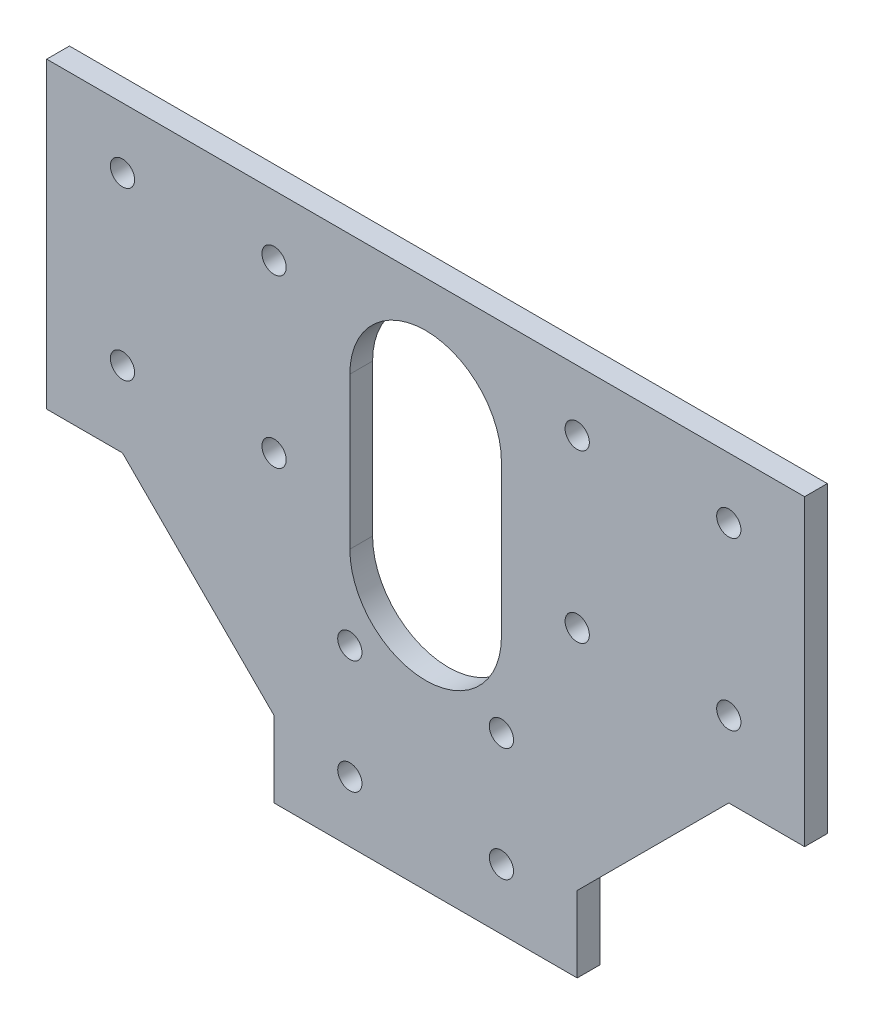
ISO-10303-21;
HEADER;
FILE_DESCRIPTION(('STEP AP214'),'2;1');
FILE_NAME('part.step','',(''),(''),'','','');
FILE_SCHEMA(('AUTOMOTIVE_DESIGN { 1 0 10303 214 1 1 1 1 }'));
ENDSEC;
DATA;
#1=APPLICATION_CONTEXT('core data for automotive mechanical design processes');
#2=APPLICATION_PROTOCOL_DEFINITION('international standard','automotive_design',2000,#1);
#3=PRODUCT_CONTEXT('',#1,'mechanical');
#4=PRODUCT('Part','Part','',(#3));
#5=PRODUCT_RELATED_PRODUCT_CATEGORY('part','',(#4));
#6=PRODUCT_DEFINITION_FORMATION('','',#4);
#7=PRODUCT_DEFINITION_CONTEXT('part definition',#1,'design');
#8=PRODUCT_DEFINITION('design','',#6,#7);
#9=PRODUCT_DEFINITION_SHAPE('','',#8);
#10=(LENGTH_UNIT() NAMED_UNIT(*) SI_UNIT(.MILLI.,.METRE.));
#11=(NAMED_UNIT(*) PLANE_ANGLE_UNIT() SI_UNIT($,.RADIAN.));
#12=(NAMED_UNIT(*) SI_UNIT($,.STERADIAN.) SOLID_ANGLE_UNIT());
#13=UNCERTAINTY_MEASURE_WITH_UNIT(LENGTH_MEASURE(1.E-05),#10,'distance_accuracy_value','');
#14=(GEOMETRIC_REPRESENTATION_CONTEXT(3) GLOBAL_UNCERTAINTY_ASSIGNED_CONTEXT((#13)) GLOBAL_UNIT_ASSIGNED_CONTEXT((#10,
#11,#12)) REPRESENTATION_CONTEXT('',''));
#15=CARTESIAN_POINT('',(0.,0.,0.));
#16=DIRECTION('',(0.,0.,1.));
#17=DIRECTION('',(1.,0.,0.));
#18=AXIS2_PLACEMENT_3D('',#15,#16,#17);
#19=CARTESIAN_POINT('',(-9.99999999999996,-10.,3.));
#20=DIRECTION('',(0.707106781186546,0.707106781186549,0.));
#21=DIRECTION('',(-0.707106781186549,0.707106781186546,0.));
#22=AXIS2_PLACEMENT_3D('',#19,#20,#21);
#23=PLANE('',#22);
#24=DIRECTION('',(0.707106781186549,-0.707106781186546,0.));
#25=VECTOR('',#24,1.);
#26=CARTESIAN_POINT('',(-9.99999999999996,-10.,0.));
#27=LINE('',#26,#25);
#28=CARTESIAN_POINT('',(-20.,0.,0.));
#29=VERTEX_POINT('',#28);
#30=CARTESIAN_POINT('',(0.,-19.9999999999999,0.));
#31=VERTEX_POINT('',#30);
#32=EDGE_CURVE('E242',#29,#31,#27,.T.);
#33=ORIENTED_EDGE('',*,*,#32,.T.);
#34=DIRECTION('',(0.,0.,-1.));
#35=VECTOR('',#34,1.);
#36=CARTESIAN_POINT('',(0.,-19.9999999999999,3.));
#37=LINE('',#36,#35);
#38=CARTESIAN_POINT('',(0.,-19.9999999999999,3.));
#39=VERTEX_POINT('',#38);
#40=EDGE_CURVE('E11',#39,#31,#37,.T.);
#41=ORIENTED_EDGE('',*,*,#40,.F.);
#42=DIRECTION('',(0.707106781186549,-0.707106781186546,0.));
#43=VECTOR('',#42,1.);
#44=CARTESIAN_POINT('',(-9.99999999999996,-10.,3.));
#45=LINE('',#44,#43);
#46=CARTESIAN_POINT('',(-20.,0.,3.));
#47=VERTEX_POINT('',#46);
#48=EDGE_CURVE('E245',#47,#39,#45,.T.);
#49=ORIENTED_EDGE('',*,*,#48,.F.);
#50=DIRECTION('',(0.,0.,-1.));
#51=VECTOR('',#50,1.);
#52=CARTESIAN_POINT('',(-20.,0.,3.));
#53=LINE('',#52,#51);
#54=EDGE_CURVE('E274',#47,#29,#53,.T.);
#55=ORIENTED_EDGE('',*,*,#54,.T.);
#56=EDGE_LOOP('',(#33,#41,#49,#55));
#57=FACE_BOUND('',#56,.T.);
#58=ADVANCED_FACE('F37',(#57),#23,.F.);
#59=CARTESIAN_POINT('',(0.,0.,3.));
#60=DIRECTION('',(-1.,0.,0.));
#61=DIRECTION('',(0.,-1.,0.));
#62=AXIS2_PLACEMENT_3D('',#59,#60,#61);
#63=PLANE('',#62);
#64=DIRECTION('',(0.,1.,0.));
#65=VECTOR('',#64,1.);
#66=CARTESIAN_POINT('',(0.,0.,0.));
#67=LINE('',#66,#65);
#68=CARTESIAN_POINT('',(0.,-30.,0.));
#69=VERTEX_POINT('',#68);
#70=EDGE_CURVE('E277',#69,#31,#67,.T.);
#71=ORIENTED_EDGE('',*,*,#70,.F.);
#72=DIRECTION('',(0.,0.,-1.));
#73=VECTOR('',#72,1.);
#74=CARTESIAN_POINT('',(0.,-30.,3.));
#75=LINE('',#74,#73);
#76=CARTESIAN_POINT('',(0.,-30.,3.));
#77=VERTEX_POINT('',#76);
#78=EDGE_CURVE('E44',#77,#69,#75,.T.);
#79=ORIENTED_EDGE('',*,*,#78,.F.);
#80=DIRECTION('',(0.,1.,0.));
#81=VECTOR('',#80,1.);
#82=CARTESIAN_POINT('',(0.,0.,3.));
#83=LINE('',#82,#81);
#84=EDGE_CURVE('E247',#77,#39,#83,.T.);
#85=ORIENTED_EDGE('',*,*,#84,.T.);
#86=ORIENTED_EDGE('',*,*,#40,.T.);
#87=EDGE_LOOP('',(#71,#79,#85,#86));
#88=FACE_BOUND('',#87,.T.);
#89=ADVANCED_FACE('F324',(#88),#63,.T.);
#90=CARTESIAN_POINT('',(0.,-30.,3.));
#91=DIRECTION('',(0.,-1.,0.));
#92=DIRECTION('',(1.,0.,0.));
#93=AXIS2_PLACEMENT_3D('',#90,#91,#92);
#94=PLANE('',#93);
#95=DIRECTION('',(-1.,0.,0.));
#96=VECTOR('',#95,1.);
#97=CARTESIAN_POINT('',(0.,-30.,0.));
#98=LINE('',#97,#96);
#99=CARTESIAN_POINT('',(40.,-30.,0.));
#100=VERTEX_POINT('',#99);
#101=EDGE_CURVE('E280',#100,#69,#98,.T.);
#102=ORIENTED_EDGE('',*,*,#101,.F.);
#103=DIRECTION('',(0.,0.,-1.));
#104=VECTOR('',#103,1.);
#105=CARTESIAN_POINT('',(40.,-30.,3.));
#106=LINE('',#105,#104);
#107=CARTESIAN_POINT('',(40.,-30.,3.));
#108=VERTEX_POINT('',#107);
#109=EDGE_CURVE('E316',#108,#100,#106,.T.);
#110=ORIENTED_EDGE('',*,*,#109,.F.);
#111=DIRECTION('',(-1.,0.,0.));
#112=VECTOR('',#111,1.);
#113=CARTESIAN_POINT('',(0.,-30.,3.));
#114=LINE('',#113,#112);
#115=EDGE_CURVE('E251',#108,#77,#114,.T.);
#116=ORIENTED_EDGE('',*,*,#115,.T.);
#117=ORIENTED_EDGE('',*,*,#78,.T.);
#118=EDGE_LOOP('',(#102,#110,#116,#117));
#119=FACE_BOUND('',#118,.T.);
#120=ADVANCED_FACE('F320',(#119),#94,.T.);
#121=CARTESIAN_POINT('',(40.,0.,3.));
#122=DIRECTION('',(1.,0.,0.));
#123=DIRECTION('',(0.,1.,0.));
#124=AXIS2_PLACEMENT_3D('',#121,#122,#123);
#125=PLANE('',#124);
#126=DIRECTION('',(0.,-1.,0.));
#127=VECTOR('',#126,1.);
#128=CARTESIAN_POINT('',(40.,0.,0.));
#129=LINE('',#128,#127);
#130=CARTESIAN_POINT('',(40.,-19.9999999999999,0.));
#131=VERTEX_POINT('',#130);
#132=EDGE_CURVE('E283',#131,#100,#129,.T.);
#133=ORIENTED_EDGE('',*,*,#132,.F.);
#134=DIRECTION('',(0.,0.,-1.));
#135=VECTOR('',#134,1.);
#136=CARTESIAN_POINT('',(40.,-19.9999999999999,3.));
#137=LINE('',#136,#135);
#138=CARTESIAN_POINT('',(40.,-19.9999999999999,3.));
#139=VERTEX_POINT('',#138);
#140=EDGE_CURVE('E314',#139,#131,#137,.T.);
#141=ORIENTED_EDGE('',*,*,#140,.F.);
#142=DIRECTION('',(0.,-1.,0.));
#143=VECTOR('',#142,1.);
#144=CARTESIAN_POINT('',(40.,0.,3.));
#145=LINE('',#144,#143);
#146=EDGE_CURVE('E254',#139,#108,#145,.T.);
#147=ORIENTED_EDGE('',*,*,#146,.T.);
#148=ORIENTED_EDGE('',*,*,#109,.T.);
#149=EDGE_LOOP('',(#133,#141,#147,#148));
#150=FACE_BOUND('',#149,.T.);
#151=ADVANCED_FACE('F331',(#150),#125,.T.);
#152=CARTESIAN_POINT('',(29.9999999999999,-30.,3.));
#153=DIRECTION('',(-0.707106781186546,0.707106781186548,0.));
#154=DIRECTION('',(-0.707106781186549,-0.707106781186546,0.));
#155=AXIS2_PLACEMENT_3D('',#152,#153,#154);
#156=PLANE('',#155);
#157=DIRECTION('',(0.707106781186549,0.707106781186546,0.));
#158=VECTOR('',#157,1.);
#159=CARTESIAN_POINT('',(29.9999999999999,-30.,0.));
#160=LINE('',#159,#158);
#161=CARTESIAN_POINT('',(60.,0.,0.));
#162=VERTEX_POINT('',#161);
#163=EDGE_CURVE('E286',#131,#162,#160,.T.);
#164=ORIENTED_EDGE('',*,*,#163,.T.);
#165=DIRECTION('',(0.,0.,-1.));
#166=VECTOR('',#165,1.);
#167=CARTESIAN_POINT('',(60.,0.,3.));
#168=LINE('',#167,#166);
#169=CARTESIAN_POINT('',(60.,0.,3.));
#170=VERTEX_POINT('',#169);
#171=EDGE_CURVE('E312',#170,#162,#168,.T.);
#172=ORIENTED_EDGE('',*,*,#171,.F.);
#173=DIRECTION('',(0.707106781186549,0.707106781186546,0.));
#174=VECTOR('',#173,1.);
#175=CARTESIAN_POINT('',(29.9999999999999,-30.,3.));
#176=LINE('',#175,#174);
#177=EDGE_CURVE('E257',#139,#170,#176,.T.);
#178=ORIENTED_EDGE('',*,*,#177,.F.);
#179=ORIENTED_EDGE('',*,*,#140,.T.);
#180=EDGE_LOOP('',(#164,#172,#178,#179));
#181=FACE_BOUND('',#180,.T.);
#182=ADVANCED_FACE('F360',(#181),#156,.F.);
#183=CARTESIAN_POINT('',(0.,0.,3.));
#184=DIRECTION('',(0.,-1.,0.));
#185=DIRECTION('',(1.,0.,0.));
#186=AXIS2_PLACEMENT_3D('',#183,#184,#185);
#187=PLANE('',#186);
#188=DIRECTION('',(-1.,0.,0.));
#189=VECTOR('',#188,1.);
#190=CARTESIAN_POINT('',(0.,0.,0.));
#191=LINE('',#190,#189);
#192=CARTESIAN_POINT('',(70.,0.,0.));
#193=VERTEX_POINT('',#192);
#194=EDGE_CURVE('E289',#193,#162,#191,.T.);
#195=ORIENTED_EDGE('',*,*,#194,.F.);
#196=DIRECTION('',(0.,0.,-1.));
#197=VECTOR('',#196,1.);
#198=CARTESIAN_POINT('',(70.,0.,3.));
#199=LINE('',#198,#197);
#200=CARTESIAN_POINT('',(70.,0.,3.));
#201=VERTEX_POINT('',#200);
#202=EDGE_CURVE('E310',#201,#193,#199,.T.);
#203=ORIENTED_EDGE('',*,*,#202,.F.);
#204=DIRECTION('',(-1.,0.,0.));
#205=VECTOR('',#204,1.);
#206=CARTESIAN_POINT('',(0.,0.,3.));
#207=LINE('',#206,#205);
#208=EDGE_CURVE('E259',#201,#170,#207,.T.);
#209=ORIENTED_EDGE('',*,*,#208,.T.);
#210=ORIENTED_EDGE('',*,*,#171,.T.);
#211=EDGE_LOOP('',(#195,#203,#209,#210));
#212=FACE_BOUND('',#211,.T.);
#213=ADVANCED_FACE('F357',(#212),#187,.T.);
#214=CARTESIAN_POINT('',(70.,0.,3.));
#215=DIRECTION('',(1.,0.,0.));
#216=DIRECTION('',(0.,0.,-1.));
#217=AXIS2_PLACEMENT_3D('',#214,#215,#216);
#218=PLANE('',#217);
#219=DIRECTION('',(0.,-1.,0.));
#220=VECTOR('',#219,1.);
#221=CARTESIAN_POINT('',(70.,0.,0.));
#222=LINE('',#221,#220);
#223=CARTESIAN_POINT('',(70.,40.,0.));
#224=VERTEX_POINT('',#223);
#225=EDGE_CURVE('E292',#224,#193,#222,.T.);
#226=ORIENTED_EDGE('',*,*,#225,.F.);
#227=DIRECTION('',(0.,0.,-1.));
#228=VECTOR('',#227,1.);
#229=CARTESIAN_POINT('',(70.,40.,3.));
#230=LINE('',#229,#228);
#231=CARTESIAN_POINT('',(70.,40.,3.));
#232=VERTEX_POINT('',#231);
#233=EDGE_CURVE('E308',#232,#224,#230,.T.);
#234=ORIENTED_EDGE('',*,*,#233,.F.);
#235=DIRECTION('',(0.,-1.,0.));
#236=VECTOR('',#235,1.);
#237=CARTESIAN_POINT('',(70.,0.,3.));
#238=LINE('',#237,#236);
#239=EDGE_CURVE('E262',#232,#201,#238,.T.);
#240=ORIENTED_EDGE('',*,*,#239,.T.);
#241=ORIENTED_EDGE('',*,*,#202,.T.);
#242=EDGE_LOOP('',(#226,#234,#240,#241));
#243=FACE_BOUND('',#242,.T.);
#244=ADVANCED_FACE('F353',(#243),#218,.T.);
#245=CARTESIAN_POINT('',(0.,40.,3.));
#246=DIRECTION('',(0.,1.,0.));
#247=DIRECTION('',(0.,0.,1.));
#248=AXIS2_PLACEMENT_3D('',#245,#246,#247);
#249=PLANE('',#248);
#250=DIRECTION('',(1.,0.,0.));
#251=VECTOR('',#250,1.);
#252=CARTESIAN_POINT('',(0.,40.,0.));
#253=LINE('',#252,#251);
#254=CARTESIAN_POINT('',(-30.,40.,0.));
#255=VERTEX_POINT('',#254);
#256=EDGE_CURVE('E295',#255,#224,#253,.T.);
#257=ORIENTED_EDGE('',*,*,#256,.F.);
#258=DIRECTION('',(0.,0.,-1.));
#259=VECTOR('',#258,1.);
#260=CARTESIAN_POINT('',(-30.,40.,3.));
#261=LINE('',#260,#259);
#262=CARTESIAN_POINT('',(-30.,40.,3.));
#263=VERTEX_POINT('',#262);
#264=EDGE_CURVE('E306',#263,#255,#261,.T.);
#265=ORIENTED_EDGE('',*,*,#264,.F.);
#266=DIRECTION('',(1.,0.,0.));
#267=VECTOR('',#266,1.);
#268=CARTESIAN_POINT('',(0.,40.,3.));
#269=LINE('',#268,#267);
#270=EDGE_CURVE('E265',#263,#232,#269,.T.);
#271=ORIENTED_EDGE('',*,*,#270,.T.);
#272=ORIENTED_EDGE('',*,*,#233,.T.);
#273=EDGE_LOOP('',(#257,#265,#271,#272));
#274=FACE_BOUND('',#273,.T.);
#275=ADVANCED_FACE('F349',(#274),#249,.T.);
#276=CARTESIAN_POINT('',(-30.,0.,3.));
#277=DIRECTION('',(-1.,0.,0.));
#278=DIRECTION('',(0.,0.,1.));
#279=AXIS2_PLACEMENT_3D('',#276,#277,#278);
#280=PLANE('',#279);
#281=DIRECTION('',(0.,1.,0.));
#282=VECTOR('',#281,1.);
#283=CARTESIAN_POINT('',(-30.,0.,0.));
#284=LINE('',#283,#282);
#285=CARTESIAN_POINT('',(-30.,0.,0.));
#286=VERTEX_POINT('',#285);
#287=EDGE_CURVE('E298',#286,#255,#284,.T.);
#288=ORIENTED_EDGE('',*,*,#287,.F.);
#289=DIRECTION('',(0.,0.,-1.));
#290=VECTOR('',#289,1.);
#291=CARTESIAN_POINT('',(-30.,0.,3.));
#292=LINE('',#291,#290);
#293=CARTESIAN_POINT('',(-30.,0.,3.));
#294=VERTEX_POINT('',#293);
#295=EDGE_CURVE('E304',#294,#286,#292,.T.);
#296=ORIENTED_EDGE('',*,*,#295,.F.);
#297=DIRECTION('',(0.,1.,0.));
#298=VECTOR('',#297,1.);
#299=CARTESIAN_POINT('',(-30.,0.,3.));
#300=LINE('',#299,#298);
#301=EDGE_CURVE('E268',#294,#263,#300,.T.);
#302=ORIENTED_EDGE('',*,*,#301,.T.);
#303=ORIENTED_EDGE('',*,*,#264,.T.);
#304=EDGE_LOOP('',(#288,#296,#302,#303));
#305=FACE_BOUND('',#304,.T.);
#306=ADVANCED_FACE('F345',(#305),#280,.T.);
#307=CARTESIAN_POINT('',(0.,0.,3.));
#308=DIRECTION('',(0.,-1.,0.));
#309=DIRECTION('',(1.,0.,0.));
#310=AXIS2_PLACEMENT_3D('',#307,#308,#309);
#311=PLANE('',#310);
#312=DIRECTION('',(-1.,0.,0.));
#313=VECTOR('',#312,1.);
#314=CARTESIAN_POINT('',(0.,0.,0.));
#315=LINE('',#314,#313);
#316=EDGE_CURVE('E248',#29,#286,#315,.T.);
#317=ORIENTED_EDGE('',*,*,#316,.F.);
#318=ORIENTED_EDGE('',*,*,#54,.F.);
#319=DIRECTION('',(-1.,0.,0.));
#320=VECTOR('',#319,1.);
#321=CARTESIAN_POINT('',(0.,0.,3.));
#322=LINE('',#321,#320);
#323=EDGE_CURVE('E271',#47,#294,#322,.T.);
#324=ORIENTED_EDGE('',*,*,#323,.T.);
#325=ORIENTED_EDGE('',*,*,#295,.T.);
#326=EDGE_LOOP('',(#317,#318,#324,#325));
#327=FACE_BOUND('',#326,.T.);
#328=ADVANCED_FACE('F342',(#327),#311,.T.);
#329=CARTESIAN_POINT('',(0.,0.,3.));
#330=DIRECTION('',(0.,0.,1.));
#331=DIRECTION('',(1.,0.,0.));
#332=AXIS2_PLACEMENT_3D('',#329,#330,#331);
#333=PLANE('',#332);
#334=CARTESIAN_POINT('',(20.,24.,3.));
#335=DIRECTION('',(0.,0.,1.));
#336=DIRECTION('',(1.,0.,0.));
#337=AXIS2_PLACEMENT_3D('',#334,#335,#336);
#338=CIRCLE('',#337,9.99999999999999);
#339=CARTESIAN_POINT('',(30.,24.,3.));
#340=VERTEX_POINT('',#339);
#341=CARTESIAN_POINT('',(10.,24.,3.));
#342=VERTEX_POINT('',#341);
#343=EDGE_CURVE('E51',#340,#342,#338,.T.);
#344=ORIENTED_EDGE('',*,*,#343,.F.);
#345=DIRECTION('',(0.,1.,0.));
#346=VECTOR('',#345,1.);
#347=CARTESIAN_POINT('',(30.,24.,3.));
#348=LINE('',#347,#346);
#349=CARTESIAN_POINT('',(30.,4.00000000000001,3.));
#350=VERTEX_POINT('',#349);
#351=EDGE_CURVE('E154',#350,#340,#348,.T.);
#352=ORIENTED_EDGE('',*,*,#351,.F.);
#353=CARTESIAN_POINT('',(20.,4.,3.));
#354=DIRECTION('',(0.,0.,1.));
#355=DIRECTION('',(1.,0.,0.));
#356=AXIS2_PLACEMENT_3D('',#353,#354,#355);
#357=CIRCLE('',#356,9.99999999999999);
#358=CARTESIAN_POINT('',(10.,4.,3.));
#359=VERTEX_POINT('',#358);
#360=EDGE_CURVE('E157',#359,#350,#357,.T.);
#361=ORIENTED_EDGE('',*,*,#360,.F.);
#362=DIRECTION('',(0.,-1.,0.));
#363=VECTOR('',#362,1.);
#364=CARTESIAN_POINT('',(10.,24.,3.));
#365=LINE('',#364,#363);
#366=EDGE_CURVE('E163',#342,#359,#365,.T.);
#367=ORIENTED_EDGE('',*,*,#366,.F.);
#368=EDGE_LOOP('',(#344,#352,#361,#367));
#369=FACE_BOUND('',#368,.T.);
#370=CARTESIAN_POINT('',(60.,10.,3.));
#371=DIRECTION('',(0.,0.,1.));
#372=DIRECTION('',(1.,0.,0.));
#373=AXIS2_PLACEMENT_3D('',#370,#371,#372);
#374=CIRCLE('',#373,1.6);
#375=CARTESIAN_POINT('',(61.6,10.,3.));
#376=VERTEX_POINT('',#375);
#377=EDGE_CURVE('E176',#376,#376,#374,.T.);
#378=ORIENTED_EDGE('',*,*,#377,.F.);
#379=EDGE_LOOP('',(#378));
#380=FACE_BOUND('',#379,.T.);
#381=CARTESIAN_POINT('',(40.,10.,3.));
#382=DIRECTION('',(0.,0.,1.));
#383=DIRECTION('',(1.,0.,0.));
#384=AXIS2_PLACEMENT_3D('',#381,#382,#383);
#385=CIRCLE('',#384,1.6);
#386=CARTESIAN_POINT('',(41.6,10.,3.));
#387=VERTEX_POINT('',#386);
#388=EDGE_CURVE('E207',#387,#387,#385,.T.);
#389=ORIENTED_EDGE('',*,*,#388,.F.);
#390=EDGE_LOOP('',(#389));
#391=FACE_BOUND('',#390,.T.);
#392=CARTESIAN_POINT('',(0.,10.,3.));
#393=DIRECTION('',(0.,0.,1.));
#394=DIRECTION('',(1.,0.,0.));
#395=AXIS2_PLACEMENT_3D('',#392,#393,#394);
#396=CIRCLE('',#395,1.6);
#397=CARTESIAN_POINT('',(1.60000000000001,10.,3.));
#398=VERTEX_POINT('',#397);
#399=EDGE_CURVE('E201',#398,#398,#396,.T.);
#400=ORIENTED_EDGE('',*,*,#399,.F.);
#401=EDGE_LOOP('',(#400));
#402=FACE_BOUND('',#401,.T.);
#403=CARTESIAN_POINT('',(-20.,32.,3.));
#404=DIRECTION('',(0.,0.,1.));
#405=DIRECTION('',(1.,0.,0.));
#406=AXIS2_PLACEMENT_3D('',#403,#404,#405);
#407=CIRCLE('',#406,1.6);
#408=CARTESIAN_POINT('',(-18.4,32.,3.));
#409=VERTEX_POINT('',#408);
#410=EDGE_CURVE('E195',#409,#409,#407,.T.);
#411=ORIENTED_EDGE('',*,*,#410,.F.);
#412=EDGE_LOOP('',(#411));
#413=FACE_BOUND('',#412,.T.);
#414=CARTESIAN_POINT('',(30.,-7.,3.));
#415=DIRECTION('',(0.,0.,1.));
#416=DIRECTION('',(1.,0.,0.));
#417=AXIS2_PLACEMENT_3D('',#414,#415,#416);
#418=CIRCLE('',#417,1.60000000000001);
#419=CARTESIAN_POINT('',(31.6,-7.,3.));
#420=VERTEX_POINT('',#419);
#421=EDGE_CURVE('E231',#420,#420,#418,.T.);
#422=ORIENTED_EDGE('',*,*,#421,.F.);
#423=EDGE_LOOP('',(#422));
#424=FACE_BOUND('',#423,.T.);
#425=CARTESIAN_POINT('',(10.,-22.,3.));
#426=DIRECTION('',(0.,0.,1.));
#427=DIRECTION('',(1.,0.,0.));
#428=AXIS2_PLACEMENT_3D('',#425,#426,#427);
#429=CIRCLE('',#428,1.6);
#430=CARTESIAN_POINT('',(11.6,-22.,3.));
#431=VERTEX_POINT('',#430);
#432=EDGE_CURVE('E218',#431,#431,#429,.T.);
#433=ORIENTED_EDGE('',*,*,#432,.F.);
#434=EDGE_LOOP('',(#433));
#435=FACE_BOUND('',#434,.T.);
#436=CARTESIAN_POINT('',(30.,-22.,3.));
#437=DIRECTION('',(0.,0.,1.));
#438=DIRECTION('',(1.,0.,0.));
#439=AXIS2_PLACEMENT_3D('',#436,#437,#438);
#440=CIRCLE('',#439,1.6);
#441=CARTESIAN_POINT('',(31.6,-22.,3.));
#442=VERTEX_POINT('',#441);
#443=EDGE_CURVE('E219',#442,#442,#440,.T.);
#444=ORIENTED_EDGE('',*,*,#443,.F.);
#445=EDGE_LOOP('',(#444));
#446=FACE_BOUND('',#445,.T.);
#447=CARTESIAN_POINT('',(-20.,10.,3.));
#448=DIRECTION('',(0.,0.,1.));
#449=DIRECTION('',(1.,0.,0.));
#450=AXIS2_PLACEMENT_3D('',#447,#448,#449);
#451=CIRCLE('',#450,1.6);
#452=CARTESIAN_POINT('',(-18.4,10.,3.));
#453=VERTEX_POINT('',#452);
#454=EDGE_CURVE('E194',#453,#453,#451,.T.);
#455=ORIENTED_EDGE('',*,*,#454,.F.);
#456=EDGE_LOOP('',(#455));
#457=FACE_BOUND('',#456,.T.);
#458=CARTESIAN_POINT('',(60.,32.,3.));
#459=DIRECTION('',(0.,0.,1.));
#460=DIRECTION('',(1.,0.,0.));
#461=AXIS2_PLACEMENT_3D('',#458,#459,#460);
#462=CIRCLE('',#461,1.6);
#463=CARTESIAN_POINT('',(61.6,32.,3.));
#464=VERTEX_POINT('',#463);
#465=EDGE_CURVE('E177',#464,#464,#462,.T.);
#466=ORIENTED_EDGE('',*,*,#465,.F.);
#467=EDGE_LOOP('',(#466));
#468=FACE_BOUND('',#467,.T.);
#469=CARTESIAN_POINT('',(40.,32.,3.));
#470=DIRECTION('',(0.,0.,1.));
#471=DIRECTION('',(1.,0.,0.));
#472=AXIS2_PLACEMENT_3D('',#469,#470,#471);
#473=CIRCLE('',#472,1.6);
#474=CARTESIAN_POINT('',(41.6,32.,3.));
#475=VERTEX_POINT('',#474);
#476=EDGE_CURVE('E183',#475,#475,#473,.T.);
#477=ORIENTED_EDGE('',*,*,#476,.F.);
#478=EDGE_LOOP('',(#477));
#479=FACE_BOUND('',#478,.T.);
#480=CARTESIAN_POINT('',(0.,32.,3.));
#481=DIRECTION('',(0.,0.,1.));
#482=DIRECTION('',(1.,0.,0.));
#483=AXIS2_PLACEMENT_3D('',#480,#481,#482);
#484=CIRCLE('',#483,1.6);
#485=CARTESIAN_POINT('',(1.6,32.,3.));
#486=VERTEX_POINT('',#485);
#487=EDGE_CURVE('E169',#486,#486,#484,.T.);
#488=ORIENTED_EDGE('',*,*,#487,.F.);
#489=EDGE_LOOP('',(#488));
#490=FACE_BOUND('',#489,.T.);
#491=CARTESIAN_POINT('',(10.,-7.,3.));
#492=DIRECTION('',(0.,0.,1.));
#493=DIRECTION('',(1.,0.,0.));
#494=AXIS2_PLACEMENT_3D('',#491,#492,#493);
#495=CIRCLE('',#494,1.6);
#496=CARTESIAN_POINT('',(11.6,-7.,3.));
#497=VERTEX_POINT('',#496);
#498=EDGE_CURVE('E230',#497,#497,#495,.T.);
#499=ORIENTED_EDGE('',*,*,#498,.F.);
#500=EDGE_LOOP('',(#499));
#501=FACE_BOUND('',#500,.T.);
#502=ORIENTED_EDGE('',*,*,#48,.T.);
#503=ORIENTED_EDGE('',*,*,#84,.F.);
#504=ORIENTED_EDGE('',*,*,#115,.F.);
#505=ORIENTED_EDGE('',*,*,#146,.F.);
#506=ORIENTED_EDGE('',*,*,#177,.T.);
#507=ORIENTED_EDGE('',*,*,#208,.F.);
#508=ORIENTED_EDGE('',*,*,#239,.F.);
#509=ORIENTED_EDGE('',*,*,#270,.F.);
#510=ORIENTED_EDGE('',*,*,#301,.F.);
#511=ORIENTED_EDGE('',*,*,#323,.F.);
#512=EDGE_LOOP('',(#502,#503,#504,#505,#506,#507,#508,#509,#510,#511));
#513=FACE_BOUND('',#512,.T.);
#514=ADVANCED_FACE('F335',(#369,#380,#391,#402,#413,#424,#435,#446,#457,#468,#479,#490,#501,
#513),#333,.T.);
#515=CARTESIAN_POINT('',(0.,0.,0.));
#516=DIRECTION('',(0.,0.,1.));
#517=DIRECTION('',(1.,0.,0.));
#518=AXIS2_PLACEMENT_3D('',#515,#516,#517);
#519=PLANE('',#518);
#520=DIRECTION('',(0.,1.,0.));
#521=VECTOR('',#520,1.);
#522=CARTESIAN_POINT('',(30.,24.,0.));
#523=LINE('',#522,#521);
#524=CARTESIAN_POINT('',(30.,4.00000000000001,0.));
#525=VERTEX_POINT('',#524);
#526=CARTESIAN_POINT('',(30.,24.,0.));
#527=VERTEX_POINT('',#526);
#528=EDGE_CURVE('E144',#525,#527,#523,.T.);
#529=ORIENTED_EDGE('',*,*,#528,.T.);
#530=CARTESIAN_POINT('',(20.,24.,0.));
#531=DIRECTION('',(0.,0.,1.));
#532=DIRECTION('',(1.,0.,0.));
#533=AXIS2_PLACEMENT_3D('',#530,#531,#532);
#534=CIRCLE('',#533,9.99999999999999);
#535=CARTESIAN_POINT('',(10.,24.,0.));
#536=VERTEX_POINT('',#535);
#537=EDGE_CURVE('E138',#527,#536,#534,.T.);
#538=ORIENTED_EDGE('',*,*,#537,.T.);
#539=DIRECTION('',(0.,-1.,0.));
#540=VECTOR('',#539,1.);
#541=CARTESIAN_POINT('',(10.,24.,0.));
#542=LINE('',#541,#540);
#543=CARTESIAN_POINT('',(10.,4.,0.));
#544=VERTEX_POINT('',#543);
#545=EDGE_CURVE('E147',#536,#544,#542,.T.);
#546=ORIENTED_EDGE('',*,*,#545,.T.);
#547=CARTESIAN_POINT('',(20.,4.,0.));
#548=DIRECTION('',(0.,0.,1.));
#549=DIRECTION('',(1.,0.,0.));
#550=AXIS2_PLACEMENT_3D('',#547,#548,#549);
#551=CIRCLE('',#550,9.99999999999999);
#552=EDGE_CURVE('E59',#544,#525,#551,.T.);
#553=ORIENTED_EDGE('',*,*,#552,.T.);
#554=EDGE_LOOP('',(#529,#538,#546,#553));
#555=FACE_BOUND('',#554,.T.);
#556=CARTESIAN_POINT('',(60.,10.,0.));
#557=DIRECTION('',(0.,0.,1.));
#558=DIRECTION('',(1.,0.,0.));
#559=AXIS2_PLACEMENT_3D('',#556,#557,#558);
#560=CIRCLE('',#559,1.6);
#561=CARTESIAN_POINT('',(61.6,10.,0.));
#562=VERTEX_POINT('',#561);
#563=EDGE_CURVE('E210',#562,#562,#560,.T.);
#564=ORIENTED_EDGE('',*,*,#563,.T.);
#565=EDGE_LOOP('',(#564));
#566=FACE_BOUND('',#565,.T.);
#567=CARTESIAN_POINT('',(40.,10.,0.));
#568=DIRECTION('',(0.,0.,1.));
#569=DIRECTION('',(1.,0.,0.));
#570=AXIS2_PLACEMENT_3D('',#567,#568,#569);
#571=CIRCLE('',#570,1.6);
#572=CARTESIAN_POINT('',(41.6,10.,0.));
#573=VERTEX_POINT('',#572);
#574=EDGE_CURVE('E204',#573,#573,#571,.T.);
#575=ORIENTED_EDGE('',*,*,#574,.T.);
#576=EDGE_LOOP('',(#575));
#577=FACE_BOUND('',#576,.T.);
#578=CARTESIAN_POINT('',(0.,10.,0.));
#579=DIRECTION('',(0.,0.,1.));
#580=DIRECTION('',(1.,0.,0.));
#581=AXIS2_PLACEMENT_3D('',#578,#579,#580);
#582=CIRCLE('',#581,1.6);
#583=CARTESIAN_POINT('',(1.60000000000001,10.,0.));
#584=VERTEX_POINT('',#583);
#585=EDGE_CURVE('E198',#584,#584,#582,.T.);
#586=ORIENTED_EDGE('',*,*,#585,.T.);
#587=EDGE_LOOP('',(#586));
#588=FACE_BOUND('',#587,.T.);
#589=CARTESIAN_POINT('',(-20.,32.,0.));
#590=DIRECTION('',(0.,0.,1.));
#591=DIRECTION('',(1.,0.,0.));
#592=AXIS2_PLACEMENT_3D('',#589,#590,#591);
#593=CIRCLE('',#592,1.6);
#594=CARTESIAN_POINT('',(-18.4,32.,0.));
#595=VERTEX_POINT('',#594);
#596=EDGE_CURVE('E191',#595,#595,#593,.T.);
#597=ORIENTED_EDGE('',*,*,#596,.T.);
#598=EDGE_LOOP('',(#597));
#599=FACE_BOUND('',#598,.T.);
#600=CARTESIAN_POINT('',(30.,-7.,0.));
#601=DIRECTION('',(0.,0.,1.));
#602=DIRECTION('',(1.,0.,0.));
#603=AXIS2_PLACEMENT_3D('',#600,#601,#602);
#604=CIRCLE('',#603,1.60000000000001);
#605=CARTESIAN_POINT('',(31.6,-7.,0.));
#606=VERTEX_POINT('',#605);
#607=EDGE_CURVE('E227',#606,#606,#604,.T.);
#608=ORIENTED_EDGE('',*,*,#607,.T.);
#609=EDGE_LOOP('',(#608));
#610=FACE_BOUND('',#609,.T.);
#611=CARTESIAN_POINT('',(10.,-22.,0.));
#612=DIRECTION('',(0.,0.,1.));
#613=DIRECTION('',(1.,0.,0.));
#614=AXIS2_PLACEMENT_3D('',#611,#612,#613);
#615=CIRCLE('',#614,1.6);
#616=CARTESIAN_POINT('',(11.6,-22.,0.));
#617=VERTEX_POINT('',#616);
#618=EDGE_CURVE('E234',#617,#617,#615,.T.);
#619=ORIENTED_EDGE('',*,*,#618,.T.);
#620=EDGE_LOOP('',(#619));
#621=FACE_BOUND('',#620,.T.);
#622=CARTESIAN_POINT('',(30.,-22.,0.));
#623=DIRECTION('',(0.,0.,1.));
#624=DIRECTION('',(1.,0.,0.));
#625=AXIS2_PLACEMENT_3D('',#622,#623,#624);
#626=CIRCLE('',#625,1.6);
#627=CARTESIAN_POINT('',(31.6,-22.,0.));
#628=VERTEX_POINT('',#627);
#629=EDGE_CURVE('E215',#628,#628,#626,.T.);
#630=ORIENTED_EDGE('',*,*,#629,.T.);
#631=EDGE_LOOP('',(#630));
#632=FACE_BOUND('',#631,.T.);
#633=CARTESIAN_POINT('',(-20.,10.,0.));
#634=DIRECTION('',(0.,0.,1.));
#635=DIRECTION('',(1.,0.,0.));
#636=AXIS2_PLACEMENT_3D('',#633,#634,#635);
#637=CIRCLE('',#636,1.6);
#638=CARTESIAN_POINT('',(-18.4,10.,0.));
#639=VERTEX_POINT('',#638);
#640=EDGE_CURVE('E222',#639,#639,#637,.T.);
#641=ORIENTED_EDGE('',*,*,#640,.T.);
#642=EDGE_LOOP('',(#641));
#643=FACE_BOUND('',#642,.T.);
#644=CARTESIAN_POINT('',(60.,32.,0.));
#645=DIRECTION('',(0.,0.,1.));
#646=DIRECTION('',(1.,0.,0.));
#647=AXIS2_PLACEMENT_3D('',#644,#645,#646);
#648=CIRCLE('',#647,1.6);
#649=CARTESIAN_POINT('',(61.6,32.,0.));
#650=VERTEX_POINT('',#649);
#651=EDGE_CURVE('E173',#650,#650,#648,.T.);
#652=ORIENTED_EDGE('',*,*,#651,.T.);
#653=EDGE_LOOP('',(#652));
#654=FACE_BOUND('',#653,.T.);
#655=CARTESIAN_POINT('',(40.,32.,0.));
#656=DIRECTION('',(0.,0.,1.));
#657=DIRECTION('',(1.,0.,0.));
#658=AXIS2_PLACEMENT_3D('',#655,#656,#657);
#659=CIRCLE('',#658,1.6);
#660=CARTESIAN_POINT('',(41.6,32.,0.));
#661=VERTEX_POINT('',#660);
#662=EDGE_CURVE('E180',#661,#661,#659,.T.);
#663=ORIENTED_EDGE('',*,*,#662,.T.);
#664=EDGE_LOOP('',(#663));
#665=FACE_BOUND('',#664,.T.);
#666=CARTESIAN_POINT('',(0.,32.,0.));
#667=DIRECTION('',(0.,0.,1.));
#668=DIRECTION('',(1.,0.,0.));
#669=AXIS2_PLACEMENT_3D('',#666,#667,#668);
#670=CIRCLE('',#669,1.6);
#671=CARTESIAN_POINT('',(1.6,32.,0.));
#672=VERTEX_POINT('',#671);
#673=EDGE_CURVE('E186',#672,#672,#670,.T.);
#674=ORIENTED_EDGE('',*,*,#673,.T.);
#675=EDGE_LOOP('',(#674));
#676=FACE_BOUND('',#675,.T.);
#677=CARTESIAN_POINT('',(10.,-7.,0.));
#678=DIRECTION('',(0.,0.,1.));
#679=DIRECTION('',(1.,0.,0.));
#680=AXIS2_PLACEMENT_3D('',#677,#678,#679);
#681=CIRCLE('',#680,1.6);
#682=CARTESIAN_POINT('',(11.6,-7.,0.));
#683=VERTEX_POINT('',#682);
#684=EDGE_CURVE('E239',#683,#683,#681,.T.);
#685=ORIENTED_EDGE('',*,*,#684,.T.);
#686=EDGE_LOOP('',(#685));
#687=FACE_BOUND('',#686,.T.);
#688=ORIENTED_EDGE('',*,*,#32,.F.);
#689=ORIENTED_EDGE('',*,*,#316,.T.);
#690=ORIENTED_EDGE('',*,*,#287,.T.);
#691=ORIENTED_EDGE('',*,*,#256,.T.);
#692=ORIENTED_EDGE('',*,*,#225,.T.);
#693=ORIENTED_EDGE('',*,*,#194,.T.);
#694=ORIENTED_EDGE('',*,*,#163,.F.);
#695=ORIENTED_EDGE('',*,*,#132,.T.);
#696=ORIENTED_EDGE('',*,*,#101,.T.);
#697=ORIENTED_EDGE('',*,*,#70,.T.);
#698=EDGE_LOOP('',(#688,#689,#690,#691,#692,#693,#694,#695,#696,#697));
#699=FACE_BOUND('',#698,.T.);
#700=ADVANCED_FACE('F151',(#555,#566,#577,#588,#599,#610,#621,#632,#643,#654,#665,#676,#687,
#699),#519,.F.);
#701=CARTESIAN_POINT('',(10.,-7.,0.));
#702=DIRECTION('',(0.,0.,1.));
#703=DIRECTION('',(1.,0.,0.));
#704=AXIS2_PLACEMENT_3D('',#701,#702,#703);
#705=CYLINDRICAL_SURFACE('',#704,1.6);
#706=ORIENTED_EDGE('',*,*,#684,.F.);
#707=EDGE_LOOP('',(#706));
#708=FACE_BOUND('',#707,.T.);
#709=ORIENTED_EDGE('',*,*,#498,.T.);
#710=EDGE_LOOP('',(#709));
#711=FACE_BOUND('',#710,.T.);
#712=ADVANCED_FACE('F432',(#708,#711),#705,.F.);
#713=CARTESIAN_POINT('',(0.,32.,0.));
#714=DIRECTION('',(0.,0.,1.));
#715=DIRECTION('',(1.,0.,0.));
#716=AXIS2_PLACEMENT_3D('',#713,#714,#715);
#717=CYLINDRICAL_SURFACE('',#716,1.6);
#718=ORIENTED_EDGE('',*,*,#673,.F.);
#719=EDGE_LOOP('',(#718));
#720=FACE_BOUND('',#719,.T.);
#721=ORIENTED_EDGE('',*,*,#487,.T.);
#722=EDGE_LOOP('',(#721));
#723=FACE_BOUND('',#722,.T.);
#724=ADVANCED_FACE('F437',(#720,#723),#717,.F.);
#725=CARTESIAN_POINT('',(40.,32.,0.));
#726=DIRECTION('',(0.,0.,1.));
#727=DIRECTION('',(1.,0.,0.));
#728=AXIS2_PLACEMENT_3D('',#725,#726,#727);
#729=CYLINDRICAL_SURFACE('',#728,1.6);
#730=ORIENTED_EDGE('',*,*,#662,.F.);
#731=EDGE_LOOP('',(#730));
#732=FACE_BOUND('',#731,.T.);
#733=ORIENTED_EDGE('',*,*,#476,.T.);
#734=EDGE_LOOP('',(#733));
#735=FACE_BOUND('',#734,.T.);
#736=ADVANCED_FACE('F449',(#732,#735),#729,.F.);
#737=CARTESIAN_POINT('',(60.,32.,0.));
#738=DIRECTION('',(0.,0.,1.));
#739=DIRECTION('',(1.,0.,0.));
#740=AXIS2_PLACEMENT_3D('',#737,#738,#739);
#741=CYLINDRICAL_SURFACE('',#740,1.6);
#742=ORIENTED_EDGE('',*,*,#651,.F.);
#743=EDGE_LOOP('',(#742));
#744=FACE_BOUND('',#743,.T.);
#745=ORIENTED_EDGE('',*,*,#465,.T.);
#746=EDGE_LOOP('',(#745));
#747=FACE_BOUND('',#746,.T.);
#748=ADVANCED_FACE('F459',(#744,#747),#741,.F.);
#749=CARTESIAN_POINT('',(-20.,10.,0.));
#750=DIRECTION('',(0.,0.,1.));
#751=DIRECTION('',(1.,0.,0.));
#752=AXIS2_PLACEMENT_3D('',#749,#750,#751);
#753=CYLINDRICAL_SURFACE('',#752,1.6);
#754=ORIENTED_EDGE('',*,*,#640,.F.);
#755=EDGE_LOOP('',(#754));
#756=FACE_BOUND('',#755,.T.);
#757=ORIENTED_EDGE('',*,*,#454,.T.);
#758=EDGE_LOOP('',(#757));
#759=FACE_BOUND('',#758,.T.);
#760=ADVANCED_FACE('F469',(#756,#759),#753,.F.);
#761=CARTESIAN_POINT('',(30.,-22.,0.));
#762=DIRECTION('',(0.,0.,1.));
#763=DIRECTION('',(1.,0.,0.));
#764=AXIS2_PLACEMENT_3D('',#761,#762,#763);
#765=CYLINDRICAL_SURFACE('',#764,1.6);
#766=ORIENTED_EDGE('',*,*,#629,.F.);
#767=EDGE_LOOP('',(#766));
#768=FACE_BOUND('',#767,.T.);
#769=ORIENTED_EDGE('',*,*,#443,.T.);
#770=EDGE_LOOP('',(#769));
#771=FACE_BOUND('',#770,.T.);
#772=ADVANCED_FACE('F479',(#768,#771),#765,.F.);
#773=CARTESIAN_POINT('',(10.,-22.,0.));
#774=DIRECTION('',(0.,0.,1.));
#775=DIRECTION('',(1.,0.,0.));
#776=AXIS2_PLACEMENT_3D('',#773,#774,#775);
#777=CYLINDRICAL_SURFACE('',#776,1.6);
#778=ORIENTED_EDGE('',*,*,#618,.F.);
#779=EDGE_LOOP('',(#778));
#780=FACE_BOUND('',#779,.T.);
#781=ORIENTED_EDGE('',*,*,#432,.T.);
#782=EDGE_LOOP('',(#781));
#783=FACE_BOUND('',#782,.T.);
#784=ADVANCED_FACE('F489',(#780,#783),#777,.F.);
#785=CARTESIAN_POINT('',(30.,-7.,0.));
#786=DIRECTION('',(0.,0.,1.));
#787=DIRECTION('',(1.,0.,0.));
#788=AXIS2_PLACEMENT_3D('',#785,#786,#787);
#789=CYLINDRICAL_SURFACE('',#788,1.60000000000001);
#790=ORIENTED_EDGE('',*,*,#607,.F.);
#791=EDGE_LOOP('',(#790));
#792=FACE_BOUND('',#791,.T.);
#793=ORIENTED_EDGE('',*,*,#421,.T.);
#794=EDGE_LOOP('',(#793));
#795=FACE_BOUND('',#794,.T.);
#796=ADVANCED_FACE('F499',(#792,#795),#789,.F.);
#797=CARTESIAN_POINT('',(-20.,32.,0.));
#798=DIRECTION('',(0.,0.,1.));
#799=DIRECTION('',(1.,0.,0.));
#800=AXIS2_PLACEMENT_3D('',#797,#798,#799);
#801=CYLINDRICAL_SURFACE('',#800,1.6);
#802=ORIENTED_EDGE('',*,*,#596,.F.);
#803=EDGE_LOOP('',(#802));
#804=FACE_BOUND('',#803,.T.);
#805=ORIENTED_EDGE('',*,*,#410,.T.);
#806=EDGE_LOOP('',(#805));
#807=FACE_BOUND('',#806,.T.);
#808=ADVANCED_FACE('F509',(#804,#807),#801,.F.);
#809=CARTESIAN_POINT('',(0.,10.,0.));
#810=DIRECTION('',(0.,0.,1.));
#811=DIRECTION('',(1.,0.,0.));
#812=AXIS2_PLACEMENT_3D('',#809,#810,#811);
#813=CYLINDRICAL_SURFACE('',#812,1.6);
#814=ORIENTED_EDGE('',*,*,#585,.F.);
#815=EDGE_LOOP('',(#814));
#816=FACE_BOUND('',#815,.T.);
#817=ORIENTED_EDGE('',*,*,#399,.T.);
#818=EDGE_LOOP('',(#817));
#819=FACE_BOUND('',#818,.T.);
#820=ADVANCED_FACE('F519',(#816,#819),#813,.F.);
#821=CARTESIAN_POINT('',(40.,10.,0.));
#822=DIRECTION('',(0.,0.,1.));
#823=DIRECTION('',(1.,0.,0.));
#824=AXIS2_PLACEMENT_3D('',#821,#822,#823);
#825=CYLINDRICAL_SURFACE('',#824,1.6);
#826=ORIENTED_EDGE('',*,*,#574,.F.);
#827=EDGE_LOOP('',(#826));
#828=FACE_BOUND('',#827,.T.);
#829=ORIENTED_EDGE('',*,*,#388,.T.);
#830=EDGE_LOOP('',(#829));
#831=FACE_BOUND('',#830,.T.);
#832=ADVANCED_FACE('F529',(#828,#831),#825,.F.);
#833=CARTESIAN_POINT('',(60.,10.,0.));
#834=DIRECTION('',(0.,0.,1.));
#835=DIRECTION('',(1.,0.,0.));
#836=AXIS2_PLACEMENT_3D('',#833,#834,#835);
#837=CYLINDRICAL_SURFACE('',#836,1.6);
#838=ORIENTED_EDGE('',*,*,#563,.F.);
#839=EDGE_LOOP('',(#838));
#840=FACE_BOUND('',#839,.T.);
#841=ORIENTED_EDGE('',*,*,#377,.T.);
#842=EDGE_LOOP('',(#841));
#843=FACE_BOUND('',#842,.T.);
#844=ADVANCED_FACE('F539',(#840,#843),#837,.F.);
#845=CARTESIAN_POINT('',(20.,24.,0.));
#846=DIRECTION('',(0.,0.,1.));
#847=DIRECTION('',(1.,0.,0.));
#848=AXIS2_PLACEMENT_3D('',#845,#846,#847);
#849=CYLINDRICAL_SURFACE('',#848,9.99999999999999);
#850=ORIENTED_EDGE('',*,*,#343,.T.);
#851=DIRECTION('',(0.,0.,1.));
#852=VECTOR('',#851,1.);
#853=CARTESIAN_POINT('',(10.,24.,0.));
#854=LINE('',#853,#852);
#855=EDGE_CURVE('E134',#536,#342,#854,.T.);
#856=ORIENTED_EDGE('',*,*,#855,.F.);
#857=ORIENTED_EDGE('',*,*,#537,.F.);
#858=DIRECTION('',(0.,0.,1.));
#859=VECTOR('',#858,1.);
#860=CARTESIAN_POINT('',(30.,24.,0.));
#861=LINE('',#860,#859);
#862=EDGE_CURVE('E167',#527,#340,#861,.T.);
#863=ORIENTED_EDGE('',*,*,#862,.T.);
#864=EDGE_LOOP('',(#850,#856,#857,#863));
#865=FACE_BOUND('',#864,.T.);
#866=ADVANCED_FACE('F136',(#865),#849,.F.);
#867=CARTESIAN_POINT('',(30.,24.,0.));
#868=DIRECTION('',(1.,0.,0.));
#869=DIRECTION('',(0.,1.,0.));
#870=AXIS2_PLACEMENT_3D('',#867,#868,#869);
#871=PLANE('',#870);
#872=ORIENTED_EDGE('',*,*,#351,.T.);
#873=ORIENTED_EDGE('',*,*,#862,.F.);
#874=ORIENTED_EDGE('',*,*,#528,.F.);
#875=DIRECTION('',(0.,0.,1.));
#876=VECTOR('',#875,1.);
#877=CARTESIAN_POINT('',(30.,4.00000000000001,0.));
#878=LINE('',#877,#876);
#879=EDGE_CURVE('E170',#525,#350,#878,.T.);
#880=ORIENTED_EDGE('',*,*,#879,.T.);
#881=EDGE_LOOP('',(#872,#873,#874,#880));
#882=FACE_BOUND('',#881,.T.);
#883=ADVANCED_FACE('F571',(#882),#871,.F.);
#884=CARTESIAN_POINT('',(20.,4.,0.));
#885=DIRECTION('',(0.,0.,1.));
#886=DIRECTION('',(1.,0.,0.));
#887=AXIS2_PLACEMENT_3D('',#884,#885,#886);
#888=CYLINDRICAL_SURFACE('',#887,9.99999999999999);
#889=ORIENTED_EDGE('',*,*,#360,.T.);
#890=ORIENTED_EDGE('',*,*,#879,.F.);
#891=ORIENTED_EDGE('',*,*,#552,.F.);
#892=DIRECTION('',(0.,0.,1.));
#893=VECTOR('',#892,1.);
#894=CARTESIAN_POINT('',(10.,4.,0.));
#895=LINE('',#894,#893);
#896=EDGE_CURVE('E143',#544,#359,#895,.T.);
#897=ORIENTED_EDGE('',*,*,#896,.T.);
#898=EDGE_LOOP('',(#889,#890,#891,#897));
#899=FACE_BOUND('',#898,.T.);
#900=ADVANCED_FACE('F580',(#899),#888,.F.);
#901=CARTESIAN_POINT('',(10.,24.,0.));
#902=DIRECTION('',(-1.,0.,0.));
#903=DIRECTION('',(0.,-1.,0.));
#904=AXIS2_PLACEMENT_3D('',#901,#902,#903);
#905=PLANE('',#904);
#906=ORIENTED_EDGE('',*,*,#366,.T.);
#907=ORIENTED_EDGE('',*,*,#896,.F.);
#908=ORIENTED_EDGE('',*,*,#545,.F.);
#909=ORIENTED_EDGE('',*,*,#855,.T.);
#910=EDGE_LOOP('',(#906,#907,#908,#909));
#911=FACE_BOUND('',#910,.T.);
#912=ADVANCED_FACE('F148',(#911),#905,.F.);
#913=CLOSED_SHELL('',(#58,#89,#120,#151,#182,#213,#244,#275,#306,#328,#514,#700,#712,#724,#736,
#748,#760,#772,#784,#796,#808,#820,#832,#844,#866,#883,#900,#912));
#914=MANIFOLD_SOLID_BREP('B2',#913);
#915=ADVANCED_BREP_SHAPE_REPRESENTATION('',(#18,#914),#14);
#916=SHAPE_DEFINITION_REPRESENTATION(#9,#915);
ENDSEC;
END-ISO-10303-21;
